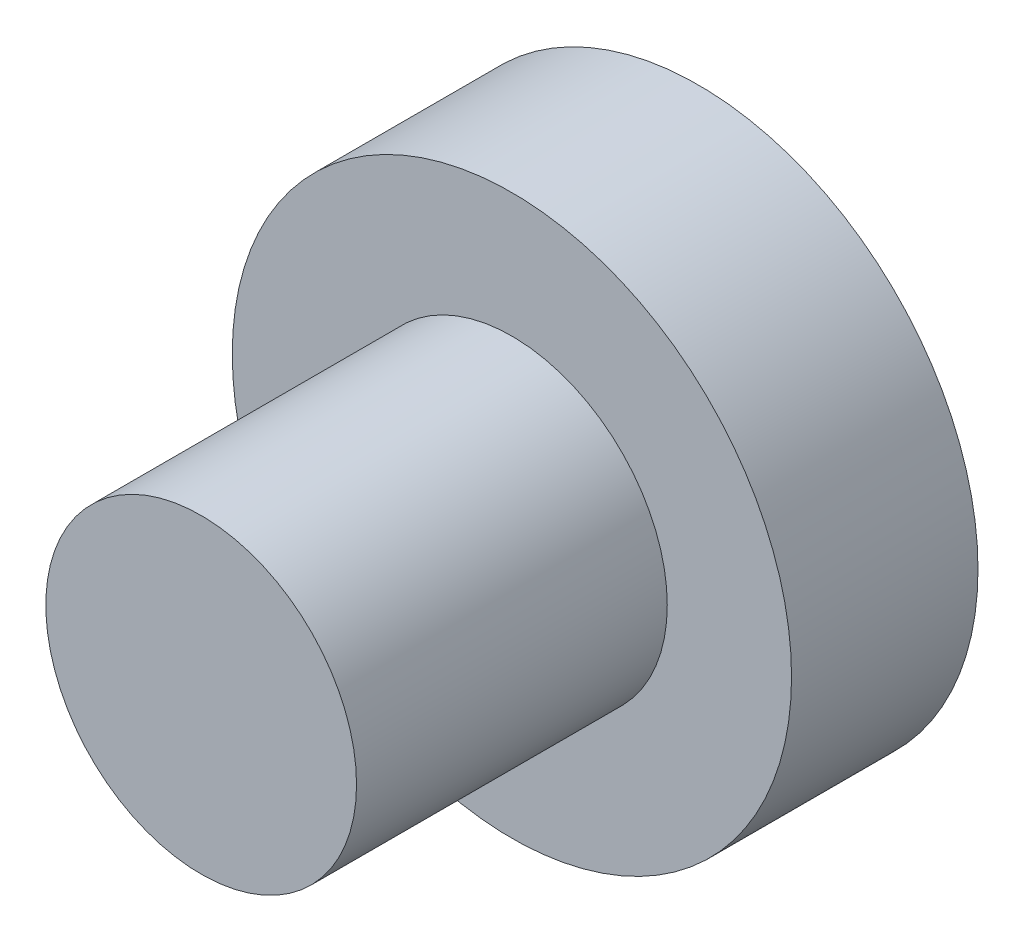
ISO-10303-21;
HEADER;
FILE_DESCRIPTION(('STEP AP214'),'2;1');
FILE_NAME('part.step','',(''),(''),'','','');
FILE_SCHEMA(('AUTOMOTIVE_DESIGN { 1 0 10303 214 1 1 1 1 }'));
ENDSEC;
DATA;
#1=APPLICATION_CONTEXT('core data for automotive mechanical design processes');
#2=APPLICATION_PROTOCOL_DEFINITION('international standard','automotive_design',2000,#1);
#3=PRODUCT_CONTEXT('',#1,'mechanical');
#4=PRODUCT('Part','Part','',(#3));
#5=PRODUCT_RELATED_PRODUCT_CATEGORY('part','',(#4));
#6=PRODUCT_DEFINITION_FORMATION('','',#4);
#7=PRODUCT_DEFINITION_CONTEXT('part definition',#1,'design');
#8=PRODUCT_DEFINITION('design','',#6,#7);
#9=PRODUCT_DEFINITION_SHAPE('','',#8);
#10=(LENGTH_UNIT() NAMED_UNIT(*) SI_UNIT(.MILLI.,.METRE.));
#11=(NAMED_UNIT(*) PLANE_ANGLE_UNIT() SI_UNIT($,.RADIAN.));
#12=(NAMED_UNIT(*) SI_UNIT($,.STERADIAN.) SOLID_ANGLE_UNIT());
#13=UNCERTAINTY_MEASURE_WITH_UNIT(LENGTH_MEASURE(1.E-05),#10,'distance_accuracy_value','');
#14=(GEOMETRIC_REPRESENTATION_CONTEXT(3) GLOBAL_UNCERTAINTY_ASSIGNED_CONTEXT((#13)) GLOBAL_UNIT_ASSIGNED_CONTEXT((#10,
#11,#12)) REPRESENTATION_CONTEXT('',''));
#15=CARTESIAN_POINT('',(0.,0.,0.));
#16=DIRECTION('',(0.,0.,1.));
#17=DIRECTION('',(1.,0.,0.));
#18=AXIS2_PLACEMENT_3D('',#15,#16,#17);
#19=CARTESIAN_POINT('',(0.,0.,8.));
#20=DIRECTION('',(0.,0.,-1.));
#21=DIRECTION('',(-1.,0.,0.));
#22=AXIS2_PLACEMENT_3D('',#19,#20,#21);
#23=CYLINDRICAL_SURFACE('',#22,2.5);
#24=CARTESIAN_POINT('',(0.,0.,8.));
#25=DIRECTION('',(0.,0.,1.));
#26=DIRECTION('',(1.,0.,0.));
#27=AXIS2_PLACEMENT_3D('',#24,#25,#26);
#28=CIRCLE('',#27,2.5);
#29=CARTESIAN_POINT('',(2.5,0.,8.));
#30=VERTEX_POINT('',#29);
#31=EDGE_CURVE('E11',#30,#30,#28,.T.);
#32=ORIENTED_EDGE('',*,*,#31,.F.);
#33=EDGE_LOOP('',(#32));
#34=FACE_BOUND('',#33,.T.);
#35=CARTESIAN_POINT('',(0.,0.,3.));
#36=DIRECTION('',(0.,0.,1.));
#37=DIRECTION('',(1.,0.,0.));
#38=AXIS2_PLACEMENT_3D('',#35,#36,#37);
#39=CIRCLE('',#38,2.5);
#40=CARTESIAN_POINT('',(2.5,0.,3.));
#41=VERTEX_POINT('',#40);
#42=EDGE_CURVE('E46',#41,#41,#39,.T.);
#43=ORIENTED_EDGE('',*,*,#42,.T.);
#44=EDGE_LOOP('',(#43));
#45=FACE_BOUND('',#44,.T.);
#46=ADVANCED_FACE('F43',(#34,#45),#23,.T.);
#47=CARTESIAN_POINT('',(0.,0.,8.));
#48=DIRECTION('',(0.,0.,1.));
#49=DIRECTION('',(1.,0.,0.));
#50=AXIS2_PLACEMENT_3D('',#47,#48,#49);
#51=PLANE('',#50);
#52=ORIENTED_EDGE('',*,*,#31,.T.);
#53=EDGE_LOOP('',(#52));
#54=FACE_BOUND('',#53,.T.);
#55=ADVANCED_FACE('F58',(#54),#51,.T.);
#56=CARTESIAN_POINT('',(0.,0.,3.));
#57=DIRECTION('',(0.,0.,1.));
#58=DIRECTION('',(1.,0.,0.));
#59=AXIS2_PLACEMENT_3D('',#56,#57,#58);
#60=PLANE('',#59);
#61=ORIENTED_EDGE('',*,*,#42,.F.);
#62=EDGE_LOOP('',(#61));
#63=FACE_BOUND('',#62,.T.);
#64=ADVANCED_FACE('F56',(#63),#60,.F.);
#65=CLOSED_SHELL('',(#46,#55,#64));
#66=MANIFOLD_SOLID_BREP('B2',#65);
#67=CARTESIAN_POINT('',(0.,0.,3.));
#68=DIRECTION('',(0.,0.,1.));
#69=DIRECTION('',(1.,0.,0.));
#70=AXIS2_PLACEMENT_3D('',#67,#68,#69);
#71=PLANE('',#70);
#72=CARTESIAN_POINT('',(0.,0.,3.));
#73=DIRECTION('',(0.,0.,1.));
#74=DIRECTION('',(1.,0.,0.));
#75=AXIS2_PLACEMENT_3D('',#72,#73,#74);
#76=CIRCLE('',#75,4.5);
#77=CARTESIAN_POINT('',(4.5,0.,3.));
#78=VERTEX_POINT('',#77);
#79=EDGE_CURVE('E42',#78,#78,#76,.T.);
#80=ORIENTED_EDGE('',*,*,#79,.T.);
#81=EDGE_LOOP('',(#80));
#82=FACE_BOUND('',#81,.T.);
#83=CARTESIAN_POINT('',(0.,0.,3.));
#84=DIRECTION('',(0.,0.,1.));
#85=DIRECTION('',(1.,0.,0.));
#86=AXIS2_PLACEMENT_3D('',#83,#84,#85);
#87=CIRCLE('',#86,2.5);
#88=CARTESIAN_POINT('',(2.5,0.,3.));
#89=VERTEX_POINT('',#88);
#90=EDGE_CURVE('E101',#89,#89,#87,.T.);
#91=ORIENTED_EDGE('',*,*,#90,.F.);
#92=EDGE_LOOP('',(#91));
#93=FACE_BOUND('',#92,.T.);
#94=ADVANCED_FACE('F90',(#82,#93),#71,.T.);
#95=CARTESIAN_POINT('',(0.,0.,0.));
#96=DIRECTION('',(0.,0.,1.));
#97=DIRECTION('',(1.,0.,0.));
#98=AXIS2_PLACEMENT_3D('',#95,#96,#97);
#99=PLANE('',#98);
#100=CARTESIAN_POINT('',(0.,0.,0.));
#101=DIRECTION('',(0.,0.,1.));
#102=DIRECTION('',(1.,0.,0.));
#103=AXIS2_PLACEMENT_3D('',#100,#101,#102);
#104=CIRCLE('',#103,4.5);
#105=CARTESIAN_POINT('',(4.5,0.,0.));
#106=VERTEX_POINT('',#105);
#107=EDGE_CURVE('E94',#106,#106,#104,.T.);
#108=ORIENTED_EDGE('',*,*,#107,.F.);
#109=EDGE_LOOP('',(#108));
#110=FACE_BOUND('',#109,.T.);
#111=CARTESIAN_POINT('',(0.,0.,0.));
#112=DIRECTION('',(0.,0.,1.));
#113=DIRECTION('',(1.,0.,0.));
#114=AXIS2_PLACEMENT_3D('',#111,#112,#113);
#115=CIRCLE('',#114,2.5);
#116=CARTESIAN_POINT('',(2.5,0.,0.));
#117=VERTEX_POINT('',#116);
#118=EDGE_CURVE('E103',#117,#117,#115,.T.);
#119=ORIENTED_EDGE('',*,*,#118,.T.);
#120=EDGE_LOOP('',(#119));
#121=FACE_BOUND('',#120,.T.);
#122=ADVANCED_FACE('F113',(#110,#121),#99,.F.);
#123=CARTESIAN_POINT('',(0.,0.,3.));
#124=DIRECTION('',(0.,0.,-1.));
#125=DIRECTION('',(-1.,0.,0.));
#126=AXIS2_PLACEMENT_3D('',#123,#124,#125);
#127=CYLINDRICAL_SURFACE('',#126,4.5);
#128=ORIENTED_EDGE('',*,*,#79,.F.);
#129=EDGE_LOOP('',(#128));
#130=FACE_BOUND('',#129,.T.);
#131=ORIENTED_EDGE('',*,*,#107,.T.);
#132=EDGE_LOOP('',(#131));
#133=FACE_BOUND('',#132,.T.);
#134=ADVANCED_FACE('F92',(#130,#133),#127,.T.);
#135=CARTESIAN_POINT('',(0.,0.,3.));
#136=DIRECTION('',(0.,0.,-1.));
#137=DIRECTION('',(-1.,0.,0.));
#138=AXIS2_PLACEMENT_3D('',#135,#136,#137);
#139=CYLINDRICAL_SURFACE('',#138,2.5);
#140=ORIENTED_EDGE('',*,*,#90,.T.);
#141=EDGE_LOOP('',(#140));
#142=FACE_BOUND('',#141,.T.);
#143=ORIENTED_EDGE('',*,*,#118,.F.);
#144=EDGE_LOOP('',(#143));
#145=FACE_BOUND('',#144,.T.);
#146=ADVANCED_FACE('F109',(#142,#145),#139,.F.);
#147=CLOSED_SHELL('',(#94,#122,#134,#146));
#148=MANIFOLD_SOLID_BREP('B6',#147);
#149=ADVANCED_BREP_SHAPE_REPRESENTATION('',(#18,#66,#148),#14);
#150=SHAPE_DEFINITION_REPRESENTATION(#9,#149);
ENDSEC;
END-ISO-10303-21;
